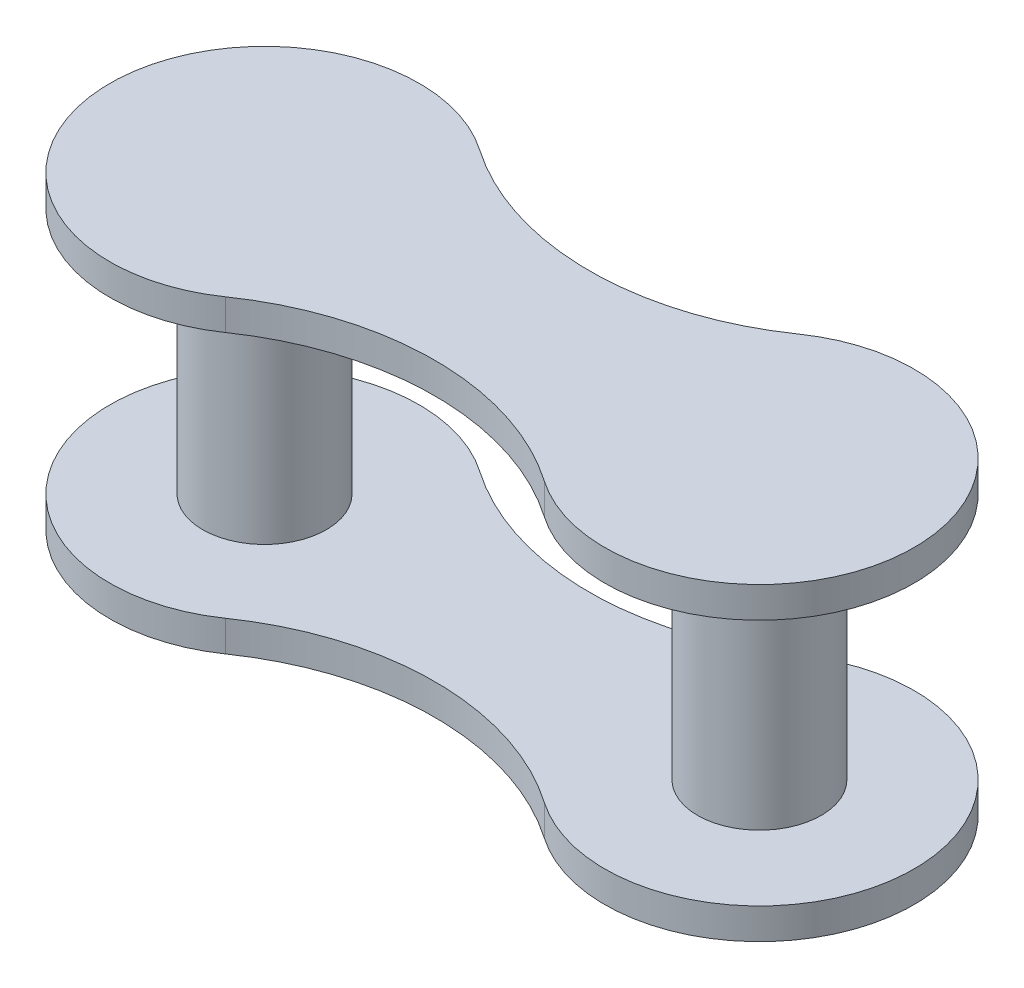
ISO-10303-21;
HEADER;
FILE_DESCRIPTION(('STEP AP214'),'2;1');
FILE_NAME('part.step','',(''),(''),'','','');
FILE_SCHEMA(('AUTOMOTIVE_DESIGN { 1 0 10303 214 1 1 1 1 }'));
ENDSEC;
DATA;
#1=APPLICATION_CONTEXT('core data for automotive mechanical design processes');
#2=APPLICATION_PROTOCOL_DEFINITION('international standard','automotive_design',2000,#1);
#3=PRODUCT_CONTEXT('',#1,'mechanical');
#4=PRODUCT('Part','Part','',(#3));
#5=PRODUCT_RELATED_PRODUCT_CATEGORY('part','',(#4));
#6=PRODUCT_DEFINITION_FORMATION('','',#4);
#7=PRODUCT_DEFINITION_CONTEXT('part definition',#1,'design');
#8=PRODUCT_DEFINITION('design','',#6,#7);
#9=PRODUCT_DEFINITION_SHAPE('','',#8);
#10=(LENGTH_UNIT() NAMED_UNIT(*) SI_UNIT(.MILLI.,.METRE.));
#11=(NAMED_UNIT(*) PLANE_ANGLE_UNIT() SI_UNIT($,.RADIAN.));
#12=(NAMED_UNIT(*) SI_UNIT($,.STERADIAN.) SOLID_ANGLE_UNIT());
#13=UNCERTAINTY_MEASURE_WITH_UNIT(LENGTH_MEASURE(1.E-05),#10,'distance_accuracy_value','');
#14=(GEOMETRIC_REPRESENTATION_CONTEXT(3) GLOBAL_UNCERTAINTY_ASSIGNED_CONTEXT((#13)) GLOBAL_UNIT_ASSIGNED_CONTEXT((#10,
#11,#12)) REPRESENTATION_CONTEXT('',''));
#15=CARTESIAN_POINT('',(0.,0.,0.));
#16=DIRECTION('',(0.,0.,1.));
#17=DIRECTION('',(1.,0.,0.));
#18=AXIS2_PLACEMENT_3D('',#15,#16,#17);
#19=CARTESIAN_POINT('',(-5.08,6.35,0.));
#20=DIRECTION('',(0.,-1.,0.));
#21=DIRECTION('',(0.,0.,-1.));
#22=AXIS2_PLACEMENT_3D('',#19,#20,#21);
#23=CYLINDRICAL_SURFACE('',#22,3.175);
#24=DIRECTION('',(0.,-1.,0.));
#25=VECTOR('',#24,1.);
#26=CARTESIAN_POINT('',(-3.27217081850534,6.35,-2.61005338078292));
#27=LINE('',#26,#25);
#28=CARTESIAN_POINT('',(-3.27217081850534,6.35,-2.61005338078292));
#29=VERTEX_POINT('',#28);
#30=CARTESIAN_POINT('',(-3.27217081850534,5.715,-2.61005338078292));
#31=VERTEX_POINT('',#30);
#32=EDGE_CURVE('E156',#29,#31,#27,.T.);
#33=ORIENTED_EDGE('',*,*,#32,.T.);
#34=CARTESIAN_POINT('',(-5.08,5.715,0.));
#35=DIRECTION('',(0.,1.,0.));
#36=DIRECTION('',(0.,0.,1.));
#37=AXIS2_PLACEMENT_3D('',#34,#35,#36);
#38=CIRCLE('',#37,3.175);
#39=CARTESIAN_POINT('',(-3.27217081850534,5.715,2.61005338078292));
#40=VERTEX_POINT('',#39);
#41=EDGE_CURVE('E71',#31,#40,#38,.T.);
#42=ORIENTED_EDGE('',*,*,#41,.T.);
#43=DIRECTION('',(0.,-1.,0.));
#44=VECTOR('',#43,1.);
#45=CARTESIAN_POINT('',(-3.27217081850534,6.35,2.61005338078292));
#46=LINE('',#45,#44);
#47=CARTESIAN_POINT('',(-3.27217081850534,6.35,2.61005338078292));
#48=VERTEX_POINT('',#47);
#49=EDGE_CURVE('E12',#48,#40,#46,.T.);
#50=ORIENTED_EDGE('',*,*,#49,.F.);
#51=CARTESIAN_POINT('',(-5.08,6.35,0.));
#52=DIRECTION('',(0.,1.,0.));
#53=DIRECTION('',(0.,0.,1.));
#54=AXIS2_PLACEMENT_3D('',#51,#52,#53);
#55=CIRCLE('',#54,3.175);
#56=EDGE_CURVE('E165',#29,#48,#55,.T.);
#57=ORIENTED_EDGE('',*,*,#56,.F.);
#58=EDGE_LOOP('',(#33,#42,#50,#57));
#59=FACE_BOUND('',#58,.T.);
#60=ADVANCED_FACE('F43',(#59),#23,.T.);
#61=CARTESIAN_POINT('',(0.,6.35,7.33425));
#62=DIRECTION('',(0.,-1.,0.));
#63=DIRECTION('',(0.,0.,-1.));
#64=AXIS2_PLACEMENT_3D('',#61,#62,#63);
#65=CYLINDRICAL_SURFACE('',#64,5.74675);
#66=ORIENTED_EDGE('',*,*,#49,.T.);
#67=CARTESIAN_POINT('',(0.,5.715,7.33425));
#68=DIRECTION('',(0.,1.,0.));
#69=DIRECTION('',(0.,0.,1.));
#70=AXIS2_PLACEMENT_3D('',#67,#68,#69);
#71=CIRCLE('',#70,5.74675);
#72=CARTESIAN_POINT('',(3.27217081850534,5.715,2.61005338078292));
#73=VERTEX_POINT('',#72);
#74=EDGE_CURVE('E213',#40,#73,#71,.F.);
#75=ORIENTED_EDGE('',*,*,#74,.T.);
#76=DIRECTION('',(0.,-1.,0.));
#77=VECTOR('',#76,1.);
#78=CARTESIAN_POINT('',(3.27217081850534,6.35,2.61005338078292));
#79=LINE('',#78,#77);
#80=CARTESIAN_POINT('',(3.27217081850534,6.35,2.61005338078292));
#81=VERTEX_POINT('',#80);
#82=EDGE_CURVE('E147',#81,#73,#79,.T.);
#83=ORIENTED_EDGE('',*,*,#82,.F.);
#84=CARTESIAN_POINT('',(0.,6.35,7.33425));
#85=DIRECTION('',(0.,1.,0.));
#86=DIRECTION('',(0.,0.,1.));
#87=AXIS2_PLACEMENT_3D('',#84,#85,#86);
#88=CIRCLE('',#87,5.74675);
#89=EDGE_CURVE('E182',#48,#81,#88,.F.);
#90=ORIENTED_EDGE('',*,*,#89,.F.);
#91=EDGE_LOOP('',(#66,#75,#83,#90));
#92=FACE_BOUND('',#91,.T.);
#93=ADVANCED_FACE('F232',(#92),#65,.F.);
#94=CARTESIAN_POINT('',(5.08,6.35,0.));
#95=DIRECTION('',(0.,-1.,0.));
#96=DIRECTION('',(0.,0.,-1.));
#97=AXIS2_PLACEMENT_3D('',#94,#95,#96);
#98=CYLINDRICAL_SURFACE('',#97,3.175);
#99=ORIENTED_EDGE('',*,*,#82,.T.);
#100=CARTESIAN_POINT('',(5.08,5.715,0.));
#101=DIRECTION('',(0.,1.,0.));
#102=DIRECTION('',(0.,0.,1.));
#103=AXIS2_PLACEMENT_3D('',#100,#101,#102);
#104=CIRCLE('',#103,3.175);
#105=CARTESIAN_POINT('',(3.27217081850534,5.715,-2.61005338078292));
#106=VERTEX_POINT('',#105);
#107=EDGE_CURVE('E190',#73,#106,#104,.T.);
#108=ORIENTED_EDGE('',*,*,#107,.T.);
#109=DIRECTION('',(0.,-1.,0.));
#110=VECTOR('',#109,1.);
#111=CARTESIAN_POINT('',(3.27217081850534,6.35,-2.61005338078292));
#112=LINE('',#111,#110);
#113=CARTESIAN_POINT('',(3.27217081850534,6.35,-2.61005338078292));
#114=VERTEX_POINT('',#113);
#115=EDGE_CURVE('E148',#114,#106,#112,.T.);
#116=ORIENTED_EDGE('',*,*,#115,.F.);
#117=CARTESIAN_POINT('',(5.08,6.35,0.));
#118=DIRECTION('',(0.,1.,0.));
#119=DIRECTION('',(0.,0.,1.));
#120=AXIS2_PLACEMENT_3D('',#117,#118,#119);
#121=CIRCLE('',#120,3.175);
#122=EDGE_CURVE('E179',#81,#114,#121,.T.);
#123=ORIENTED_EDGE('',*,*,#122,.F.);
#124=EDGE_LOOP('',(#99,#108,#116,#123));
#125=FACE_BOUND('',#124,.T.);
#126=ADVANCED_FACE('F221',(#125),#98,.T.);
#127=CARTESIAN_POINT('',(0.,6.35,-7.33425));
#128=DIRECTION('',(0.,-1.,0.));
#129=DIRECTION('',(0.,0.,-1.));
#130=AXIS2_PLACEMENT_3D('',#127,#128,#129);
#131=CYLINDRICAL_SURFACE('',#130,5.74675);
#132=CARTESIAN_POINT('',(0.,5.715,-7.33425));
#133=DIRECTION('',(0.,1.,0.));
#134=DIRECTION('',(0.,0.,1.));
#135=AXIS2_PLACEMENT_3D('',#132,#133,#134);
#136=CIRCLE('',#135,5.74675);
#137=EDGE_CURVE('E206',#106,#31,#136,.F.);
#138=ORIENTED_EDGE('',*,*,#137,.T.);
#139=ORIENTED_EDGE('',*,*,#32,.F.);
#140=CARTESIAN_POINT('',(0.,6.35,-7.33425));
#141=DIRECTION('',(0.,1.,0.));
#142=DIRECTION('',(0.,0.,1.));
#143=AXIS2_PLACEMENT_3D('',#140,#141,#142);
#144=CIRCLE('',#143,5.74675);
#145=EDGE_CURVE('E175',#29,#114,#144,.T.);
#146=ORIENTED_EDGE('',*,*,#145,.T.);
#147=ORIENTED_EDGE('',*,*,#115,.T.);
#148=EDGE_LOOP('',(#138,#139,#146,#147));
#149=FACE_BOUND('',#148,.T.);
#150=ADVANCED_FACE('F225',(#149),#131,.F.);
#151=CARTESIAN_POINT('',(0.,6.35,0.));
#152=DIRECTION('',(0.,1.,0.));
#153=DIRECTION('',(0.,0.,1.));
#154=AXIS2_PLACEMENT_3D('',#151,#152,#153);
#155=PLANE('',#154);
#156=ORIENTED_EDGE('',*,*,#56,.T.);
#157=ORIENTED_EDGE('',*,*,#89,.T.);
#158=ORIENTED_EDGE('',*,*,#122,.T.);
#159=ORIENTED_EDGE('',*,*,#145,.F.);
#160=EDGE_LOOP('',(#156,#157,#158,#159));
#161=FACE_BOUND('',#160,.T.);
#162=ADVANCED_FACE('F229',(#161),#155,.T.);
#163=CARTESIAN_POINT('',(-5.08,-17.6890531120238,0.));
#164=DIRECTION('',(0.,1.,0.));
#165=DIRECTION('',(0.,0.,1.));
#166=AXIS2_PLACEMENT_3D('',#163,#164,#165);
#167=CYLINDRICAL_SURFACE('',#166,1.27);
#168=CARTESIAN_POINT('',(-5.08,0.635,0.));
#169=DIRECTION('',(0.,1.,0.));
#170=DIRECTION('',(0.,0.,1.));
#171=AXIS2_PLACEMENT_3D('',#168,#169,#170);
#172=CIRCLE('',#171,1.27);
#173=CARTESIAN_POINT('',(-5.08,0.635,1.27));
#174=VERTEX_POINT('',#173);
#175=EDGE_CURVE('E199',#174,#174,#172,.F.);
#176=ORIENTED_EDGE('',*,*,#175,.F.);
#177=EDGE_LOOP('',(#176));
#178=FACE_BOUND('',#177,.T.);
#179=CARTESIAN_POINT('',(-5.08,5.715,0.));
#180=DIRECTION('',(0.,1.,0.));
#181=DIRECTION('',(0.,0.,1.));
#182=AXIS2_PLACEMENT_3D('',#179,#180,#181);
#183=CIRCLE('',#182,1.27);
#184=CARTESIAN_POINT('',(-5.08,5.715,1.27));
#185=VERTEX_POINT('',#184);
#186=EDGE_CURVE('E198',#185,#185,#183,.T.);
#187=ORIENTED_EDGE('',*,*,#186,.F.);
#188=EDGE_LOOP('',(#187));
#189=FACE_BOUND('',#188,.T.);
#190=ADVANCED_FACE('F317',(#178,#189),#167,.T.);
#191=CARTESIAN_POINT('',(5.08,-17.6890531120238,0.));
#192=DIRECTION('',(0.,1.,0.));
#193=DIRECTION('',(0.,0.,1.));
#194=AXIS2_PLACEMENT_3D('',#191,#192,#193);
#195=CYLINDRICAL_SURFACE('',#194,1.27);
#196=CARTESIAN_POINT('',(5.08,0.635,0.));
#197=DIRECTION('',(0.,1.,0.));
#198=DIRECTION('',(0.,0.,1.));
#199=AXIS2_PLACEMENT_3D('',#196,#197,#198);
#200=CIRCLE('',#199,1.27);
#201=CARTESIAN_POINT('',(5.08,0.635,1.27));
#202=VERTEX_POINT('',#201);
#203=EDGE_CURVE('E193',#202,#202,#200,.F.);
#204=ORIENTED_EDGE('',*,*,#203,.F.);
#205=EDGE_LOOP('',(#204));
#206=FACE_BOUND('',#205,.T.);
#207=CARTESIAN_POINT('',(5.08,5.715,0.));
#208=DIRECTION('',(0.,1.,0.));
#209=DIRECTION('',(0.,0.,1.));
#210=AXIS2_PLACEMENT_3D('',#207,#208,#209);
#211=CIRCLE('',#210,1.27);
#212=CARTESIAN_POINT('',(5.08,5.715,1.27));
#213=VERTEX_POINT('',#212);
#214=EDGE_CURVE('E197',#213,#213,#211,.T.);
#215=ORIENTED_EDGE('',*,*,#214,.F.);
#216=EDGE_LOOP('',(#215));
#217=FACE_BOUND('',#216,.T.);
#218=ADVANCED_FACE('F327',(#206,#217),#195,.T.);
#219=CARTESIAN_POINT('',(0.,5.715,0.));
#220=DIRECTION('',(0.,1.,0.));
#221=DIRECTION('',(0.,0.,1.));
#222=AXIS2_PLACEMENT_3D('',#219,#220,#221);
#223=PLANE('',#222);
#224=ORIENTED_EDGE('',*,*,#214,.T.);
#225=EDGE_LOOP('',(#224));
#226=FACE_BOUND('',#225,.T.);
#227=ORIENTED_EDGE('',*,*,#186,.T.);
#228=EDGE_LOOP('',(#227));
#229=FACE_BOUND('',#228,.T.);
#230=ORIENTED_EDGE('',*,*,#137,.F.);
#231=ORIENTED_EDGE('',*,*,#107,.F.);
#232=ORIENTED_EDGE('',*,*,#74,.F.);
#233=ORIENTED_EDGE('',*,*,#41,.F.);
#234=EDGE_LOOP('',(#230,#231,#232,#233));
#235=FACE_BOUND('',#234,.T.);
#236=ADVANCED_FACE('F233',(#226,#229,#235),#223,.F.);
#237=CARTESIAN_POINT('',(0.,0.635,0.));
#238=DIRECTION('',(0.,1.,0.));
#239=DIRECTION('',(0.,0.,1.));
#240=AXIS2_PLACEMENT_3D('',#237,#238,#239);
#241=PLANE('',#240);
#242=ORIENTED_EDGE('',*,*,#203,.T.);
#243=EDGE_LOOP('',(#242));
#244=FACE_BOUND('',#243,.T.);
#245=CARTESIAN_POINT('',(0.,0.635,-7.33425));
#246=DIRECTION('',(0.,1.,0.));
#247=DIRECTION('',(0.,0.,1.));
#248=AXIS2_PLACEMENT_3D('',#245,#246,#247);
#249=CIRCLE('',#248,5.74675);
#250=CARTESIAN_POINT('',(-3.27217081850534,0.635,-2.61005338078292));
#251=VERTEX_POINT('',#250);
#252=CARTESIAN_POINT('',(3.27217081850534,0.635,-2.61005338078292));
#253=VERTEX_POINT('',#252);
#254=EDGE_CURVE('E140',#251,#253,#249,.T.);
#255=ORIENTED_EDGE('',*,*,#254,.F.);
#256=CARTESIAN_POINT('',(-5.08,0.635,0.));
#257=DIRECTION('',(0.,1.,0.));
#258=DIRECTION('',(0.,0.,1.));
#259=AXIS2_PLACEMENT_3D('',#256,#257,#258);
#260=CIRCLE('',#259,3.175);
#261=CARTESIAN_POINT('',(-3.27217081850534,0.635,2.61005338078292));
#262=VERTEX_POINT('',#261);
#263=EDGE_CURVE('E126',#262,#251,#260,.F.);
#264=ORIENTED_EDGE('',*,*,#263,.F.);
#265=CARTESIAN_POINT('',(0.,0.635,7.33425));
#266=DIRECTION('',(0.,1.,0.));
#267=DIRECTION('',(0.,0.,1.));
#268=AXIS2_PLACEMENT_3D('',#265,#266,#267);
#269=CIRCLE('',#268,5.74675);
#270=CARTESIAN_POINT('',(3.27217081850534,0.635,2.61005338078292));
#271=VERTEX_POINT('',#270);
#272=EDGE_CURVE('E122',#271,#262,#269,.T.);
#273=ORIENTED_EDGE('',*,*,#272,.F.);
#274=CARTESIAN_POINT('',(5.08,0.635,0.));
#275=DIRECTION('',(0.,1.,0.));
#276=DIRECTION('',(0.,0.,1.));
#277=AXIS2_PLACEMENT_3D('',#274,#275,#276);
#278=CIRCLE('',#277,3.175);
#279=EDGE_CURVE('E60',#253,#271,#278,.F.);
#280=ORIENTED_EDGE('',*,*,#279,.F.);
#281=EDGE_LOOP('',(#255,#264,#273,#280));
#282=FACE_BOUND('',#281,.T.);
#283=ORIENTED_EDGE('',*,*,#175,.T.);
#284=EDGE_LOOP('',(#283));
#285=FACE_BOUND('',#284,.T.);
#286=ADVANCED_FACE('F123',(#244,#282,#285),#241,.T.);
#287=CARTESIAN_POINT('',(0.,0.,0.));
#288=DIRECTION('',(0.,1.,0.));
#289=DIRECTION('',(0.,0.,1.));
#290=AXIS2_PLACEMENT_3D('',#287,#288,#289);
#291=PLANE('',#290);
#292=CARTESIAN_POINT('',(-5.08,0.,0.));
#293=DIRECTION('',(0.,1.,0.));
#294=DIRECTION('',(0.,0.,1.));
#295=AXIS2_PLACEMENT_3D('',#292,#293,#294);
#296=CIRCLE('',#295,3.175);
#297=CARTESIAN_POINT('',(-3.27217081850534,0.,-2.61005338078292));
#298=VERTEX_POINT('',#297);
#299=CARTESIAN_POINT('',(-3.27217081850534,0.,2.61005338078292));
#300=VERTEX_POINT('',#299);
#301=EDGE_CURVE('E171',#298,#300,#296,.T.);
#302=ORIENTED_EDGE('',*,*,#301,.F.);
#303=CARTESIAN_POINT('',(0.,0.,-7.33425));
#304=DIRECTION('',(0.,1.,0.));
#305=DIRECTION('',(0.,0.,1.));
#306=AXIS2_PLACEMENT_3D('',#303,#304,#305);
#307=CIRCLE('',#306,5.74675);
#308=CARTESIAN_POINT('',(3.27217081850534,0.,-2.61005338078292));
#309=VERTEX_POINT('',#308);
#310=EDGE_CURVE('E161',#298,#309,#307,.T.);
#311=ORIENTED_EDGE('',*,*,#310,.T.);
#312=CARTESIAN_POINT('',(5.08,0.,0.));
#313=DIRECTION('',(0.,1.,0.));
#314=DIRECTION('',(0.,0.,1.));
#315=AXIS2_PLACEMENT_3D('',#312,#313,#314);
#316=CIRCLE('',#315,3.175);
#317=CARTESIAN_POINT('',(3.27217081850534,0.,2.61005338078292));
#318=VERTEX_POINT('',#317);
#319=EDGE_CURVE('E166',#318,#309,#316,.T.);
#320=ORIENTED_EDGE('',*,*,#319,.F.);
#321=CARTESIAN_POINT('',(0.,0.,7.33425));
#322=DIRECTION('',(0.,1.,0.));
#323=DIRECTION('',(0.,0.,1.));
#324=AXIS2_PLACEMENT_3D('',#321,#322,#323);
#325=CIRCLE('',#324,5.74675);
#326=EDGE_CURVE('E144',#300,#318,#325,.F.);
#327=ORIENTED_EDGE('',*,*,#326,.F.);
#328=EDGE_LOOP('',(#302,#311,#320,#327));
#329=FACE_BOUND('',#328,.T.);
#330=ADVANCED_FACE('F253',(#329),#291,.F.);
#331=EDGE_CURVE('E160',#251,#298,#27,.T.);
#332=ORIENTED_EDGE('',*,*,#331,.F.);
#333=ORIENTED_EDGE('',*,*,#254,.T.);
#334=EDGE_CURVE('E138',#253,#309,#112,.T.);
#335=ORIENTED_EDGE('',*,*,#334,.T.);
#336=ORIENTED_EDGE('',*,*,#310,.F.);
#337=EDGE_LOOP('',(#332,#333,#335,#336));
#338=FACE_BOUND('',#337,.T.);
#339=ADVANCED_FACE('F249',(#338),#131,.F.);
#340=ORIENTED_EDGE('',*,*,#279,.T.);
#341=EDGE_CURVE('E136',#271,#318,#79,.T.);
#342=ORIENTED_EDGE('',*,*,#341,.T.);
#343=ORIENTED_EDGE('',*,*,#319,.T.);
#344=ORIENTED_EDGE('',*,*,#334,.F.);
#345=EDGE_LOOP('',(#340,#342,#343,#344));
#346=FACE_BOUND('',#345,.T.);
#347=ADVANCED_FACE('F134',(#346),#98,.T.);
#348=ORIENTED_EDGE('',*,*,#272,.T.);
#349=EDGE_CURVE('E51',#262,#300,#46,.T.);
#350=ORIENTED_EDGE('',*,*,#349,.T.);
#351=ORIENTED_EDGE('',*,*,#326,.T.);
#352=ORIENTED_EDGE('',*,*,#341,.F.);
#353=EDGE_LOOP('',(#348,#350,#351,#352));
#354=FACE_BOUND('',#353,.T.);
#355=ADVANCED_FACE('F142',(#354),#65,.F.);
#356=ORIENTED_EDGE('',*,*,#263,.T.);
#357=ORIENTED_EDGE('',*,*,#331,.T.);
#358=ORIENTED_EDGE('',*,*,#301,.T.);
#359=ORIENTED_EDGE('',*,*,#349,.F.);
#360=EDGE_LOOP('',(#356,#357,#358,#359));
#361=FACE_BOUND('',#360,.T.);
#362=ADVANCED_FACE('F236',(#361),#23,.T.);
#363=CLOSED_SHELL('',(#60,#93,#126,#150,#162,#190,#218,#236,#286,#330,#339,#347,#355,#362));
#364=MANIFOLD_SOLID_BREP('B2',#363);
#365=ADVANCED_BREP_SHAPE_REPRESENTATION('',(#18,#364),#14);
#366=SHAPE_DEFINITION_REPRESENTATION(#9,#365);
ENDSEC;
END-ISO-10303-21;
